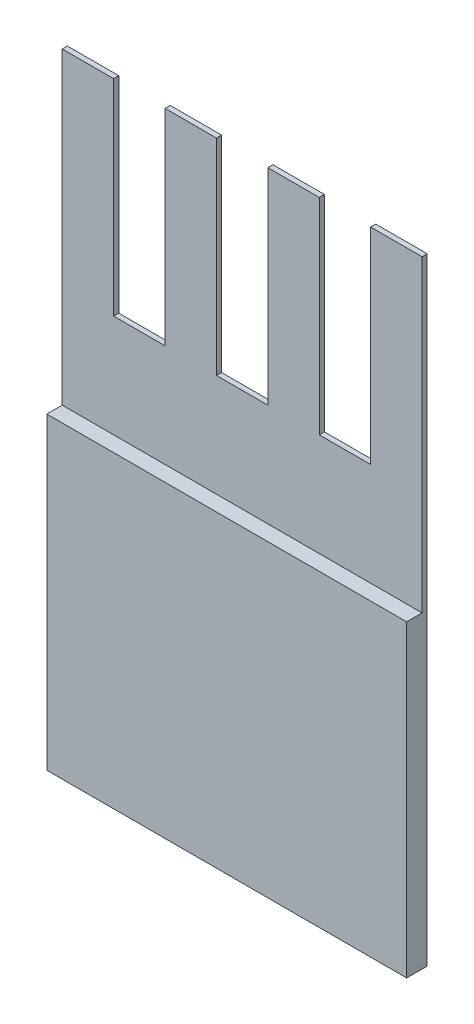
ISO-10303-21;
HEADER;
FILE_DESCRIPTION(('STEP AP214'),'2;1');
FILE_NAME('part.step','',(''),(''),'','','');
FILE_SCHEMA(('AUTOMOTIVE_DESIGN { 1 0 10303 214 1 1 1 1 }'));
ENDSEC;
DATA;
#1=APPLICATION_CONTEXT('core data for automotive mechanical design processes');
#2=APPLICATION_PROTOCOL_DEFINITION('international standard','automotive_design',2000,#1);
#3=PRODUCT_CONTEXT('',#1,'mechanical');
#4=PRODUCT('Part','Part','',(#3));
#5=PRODUCT_RELATED_PRODUCT_CATEGORY('part','',(#4));
#6=PRODUCT_DEFINITION_FORMATION('','',#4);
#7=PRODUCT_DEFINITION_CONTEXT('part definition',#1,'design');
#8=PRODUCT_DEFINITION('design','',#6,#7);
#9=PRODUCT_DEFINITION_SHAPE('','',#8);
#10=(LENGTH_UNIT() NAMED_UNIT(*) SI_UNIT(.MILLI.,.METRE.));
#11=(NAMED_UNIT(*) PLANE_ANGLE_UNIT() SI_UNIT($,.RADIAN.));
#12=(NAMED_UNIT(*) SI_UNIT($,.STERADIAN.) SOLID_ANGLE_UNIT());
#13=UNCERTAINTY_MEASURE_WITH_UNIT(LENGTH_MEASURE(1.E-05),#10,'distance_accuracy_value','');
#14=(GEOMETRIC_REPRESENTATION_CONTEXT(3) GLOBAL_UNCERTAINTY_ASSIGNED_CONTEXT((#13)) GLOBAL_UNIT_ASSIGNED_CONTEXT((#10,
#11,#12)) REPRESENTATION_CONTEXT('',''));
#15=CARTESIAN_POINT('',(0.,0.,0.));
#16=DIRECTION('',(0.,0.,1.));
#17=DIRECTION('',(1.,0.,0.));
#18=AXIS2_PLACEMENT_3D('',#15,#16,#17);
#19=CARTESIAN_POINT('',(0.,0.,2.));
#20=DIRECTION('',(0.,1.,0.));
#21=DIRECTION('',(0.,0.,1.));
#22=AXIS2_PLACEMENT_3D('',#19,#20,#21);
#23=PLANE('',#22);
#24=DIRECTION('',(1.,0.,0.));
#25=VECTOR('',#24,1.);
#26=CARTESIAN_POINT('',(0.,0.,0.5));
#27=LINE('',#26,#25);
#28=CARTESIAN_POINT('',(-17.5,0.,0.5));
#29=VERTEX_POINT('',#28);
#30=CARTESIAN_POINT('',(17.5,0.,0.5));
#31=VERTEX_POINT('',#30);
#32=EDGE_CURVE('E49',#29,#31,#27,.T.);
#33=ORIENTED_EDGE('',*,*,#32,.F.);
#34=DIRECTION('',(0.,0.,-1.));
#35=VECTOR('',#34,1.);
#36=CARTESIAN_POINT('',(-17.5,0.,2.));
#37=LINE('',#36,#35);
#38=CARTESIAN_POINT('',(-17.5,0.,2.));
#39=VERTEX_POINT('',#38);
#40=EDGE_CURVE('E11',#39,#29,#37,.T.);
#41=ORIENTED_EDGE('',*,*,#40,.F.);
#42=DIRECTION('',(1.,0.,0.));
#43=VECTOR('',#42,1.);
#44=CARTESIAN_POINT('',(0.,0.,2.));
#45=LINE('',#44,#43);
#46=CARTESIAN_POINT('',(17.5,0.,2.));
#47=VERTEX_POINT('',#46);
#48=EDGE_CURVE('E160',#39,#47,#45,.T.);
#49=ORIENTED_EDGE('',*,*,#48,.T.);
#50=DIRECTION('',(0.,0.,-1.));
#51=VECTOR('',#50,1.);
#52=CARTESIAN_POINT('',(17.5,0.,2.));
#53=LINE('',#52,#51);
#54=EDGE_CURVE('E56',#47,#31,#53,.T.);
#55=ORIENTED_EDGE('',*,*,#54,.T.);
#56=EDGE_LOOP('',(#33,#41,#49,#55));
#57=FACE_BOUND('',#56,.T.);
#58=ADVANCED_FACE('F35',(#57),#23,.T.);
#59=CARTESIAN_POINT('',(-17.5,0.,2.));
#60=DIRECTION('',(1.,0.,0.));
#61=DIRECTION('',(0.,0.,-1.));
#62=AXIS2_PLACEMENT_3D('',#59,#60,#61);
#63=PLANE('',#62);
#64=DIRECTION('',(0.,-1.,0.));
#65=VECTOR('',#64,1.);
#66=CARTESIAN_POINT('',(-17.5,0.,0.));
#67=LINE('',#66,#65);
#68=CARTESIAN_POINT('',(-17.5,30.,0.));
#69=VERTEX_POINT('',#68);
#70=CARTESIAN_POINT('',(-17.5,-30.,0.));
#71=VERTEX_POINT('',#70);
#72=EDGE_CURVE('E280',#69,#71,#67,.T.);
#73=ORIENTED_EDGE('',*,*,#72,.T.);
#74=DIRECTION('',(0.,0.,-1.));
#75=VECTOR('',#74,1.);
#76=CARTESIAN_POINT('',(-17.5,-30.,2.));
#77=LINE('',#76,#75);
#78=CARTESIAN_POINT('',(-17.5,-30.,2.));
#79=VERTEX_POINT('',#78);
#80=EDGE_CURVE('E42',#79,#71,#77,.T.);
#81=ORIENTED_EDGE('',*,*,#80,.F.);
#82=DIRECTION('',(0.,-1.,0.));
#83=VECTOR('',#82,1.);
#84=CARTESIAN_POINT('',(-17.5,0.,2.));
#85=LINE('',#84,#83);
#86=EDGE_CURVE('E282',#39,#79,#85,.T.);
#87=ORIENTED_EDGE('',*,*,#86,.F.);
#88=ORIENTED_EDGE('',*,*,#40,.T.);
#89=DIRECTION('',(0.,-1.,0.));
#90=VECTOR('',#89,1.);
#91=CARTESIAN_POINT('',(-17.5,0.,0.5));
#92=LINE('',#91,#90);
#93=CARTESIAN_POINT('',(-17.5,30.,0.5));
#94=VERTEX_POINT('',#93);
#95=EDGE_CURVE('E170',#94,#29,#92,.T.);
#96=ORIENTED_EDGE('',*,*,#95,.F.);
#97=DIRECTION('',(0.,0.,-1.));
#98=VECTOR('',#97,1.);
#99=CARTESIAN_POINT('',(-17.5,30.,0.5));
#100=LINE('',#99,#98);
#101=EDGE_CURVE('E213',#94,#69,#100,.T.);
#102=ORIENTED_EDGE('',*,*,#101,.T.);
#103=EDGE_LOOP('',(#73,#81,#87,#88,#96,#102));
#104=FACE_BOUND('',#103,.T.);
#105=ADVANCED_FACE('F301',(#104),#63,.F.);
#106=CARTESIAN_POINT('',(0.,-30.,2.));
#107=DIRECTION('',(0.,-1.,0.));
#108=DIRECTION('',(0.,0.,-1.));
#109=AXIS2_PLACEMENT_3D('',#106,#107,#108);
#110=PLANE('',#109);
#111=DIRECTION('',(-1.,0.,0.));
#112=VECTOR('',#111,1.);
#113=CARTESIAN_POINT('',(0.,-30.,0.));
#114=LINE('',#113,#112);
#115=CARTESIAN_POINT('',(17.5,-30.,0.));
#116=VERTEX_POINT('',#115);
#117=EDGE_CURVE('E291',#116,#71,#114,.T.);
#118=ORIENTED_EDGE('',*,*,#117,.F.);
#119=DIRECTION('',(0.,0.,-1.));
#120=VECTOR('',#119,1.);
#121=CARTESIAN_POINT('',(17.5,-30.,2.));
#122=LINE('',#121,#120);
#123=CARTESIAN_POINT('',(17.5,-30.,2.));
#124=VERTEX_POINT('',#123);
#125=EDGE_CURVE('E70',#124,#116,#122,.T.);
#126=ORIENTED_EDGE('',*,*,#125,.F.);
#127=DIRECTION('',(-1.,0.,0.));
#128=VECTOR('',#127,1.);
#129=CARTESIAN_POINT('',(0.,-30.,2.));
#130=LINE('',#129,#128);
#131=EDGE_CURVE('E285',#124,#79,#130,.T.);
#132=ORIENTED_EDGE('',*,*,#131,.T.);
#133=ORIENTED_EDGE('',*,*,#80,.T.);
#134=EDGE_LOOP('',(#118,#126,#132,#133));
#135=FACE_BOUND('',#134,.T.);
#136=ADVANCED_FACE('F298',(#135),#110,.T.);
#137=CARTESIAN_POINT('',(17.5,0.,2.));
#138=DIRECTION('',(1.,0.,0.));
#139=DIRECTION('',(0.,0.,-1.));
#140=AXIS2_PLACEMENT_3D('',#137,#138,#139);
#141=PLANE('',#140);
#142=DIRECTION('',(0.,-1.,0.));
#143=VECTOR('',#142,1.);
#144=CARTESIAN_POINT('',(17.5,0.,0.));
#145=LINE('',#144,#143);
#146=CARTESIAN_POINT('',(17.5,30.,0.));
#147=VERTEX_POINT('',#146);
#148=EDGE_CURVE('E283',#147,#116,#145,.T.);
#149=ORIENTED_EDGE('',*,*,#148,.F.);
#150=DIRECTION('',(0.,0.,-1.));
#151=VECTOR('',#150,1.);
#152=CARTESIAN_POINT('',(17.5,30.,0.5));
#153=LINE('',#152,#151);
#154=CARTESIAN_POINT('',(17.5,30.,0.5));
#155=VERTEX_POINT('',#154);
#156=EDGE_CURVE('E174',#155,#147,#153,.T.);
#157=ORIENTED_EDGE('',*,*,#156,.F.);
#158=DIRECTION('',(0.,-1.,0.));
#159=VECTOR('',#158,1.);
#160=CARTESIAN_POINT('',(17.5,0.,0.5));
#161=LINE('',#160,#159);
#162=EDGE_CURVE('E168',#155,#31,#161,.T.);
#163=ORIENTED_EDGE('',*,*,#162,.T.);
#164=ORIENTED_EDGE('',*,*,#54,.F.);
#165=DIRECTION('',(0.,-1.,0.));
#166=VECTOR('',#165,1.);
#167=CARTESIAN_POINT('',(17.5,0.,2.));
#168=LINE('',#167,#166);
#169=EDGE_CURVE('E162',#47,#124,#168,.T.);
#170=ORIENTED_EDGE('',*,*,#169,.T.);
#171=ORIENTED_EDGE('',*,*,#125,.T.);
#172=EDGE_LOOP('',(#149,#157,#163,#164,#170,#171));
#173=FACE_BOUND('',#172,.T.);
#174=ADVANCED_FACE('F172',(#173),#141,.T.);
#175=CARTESIAN_POINT('',(0.,0.,2.));
#176=DIRECTION('',(0.,0.,1.));
#177=DIRECTION('',(1.,0.,0.));
#178=AXIS2_PLACEMENT_3D('',#175,#176,#177);
#179=PLANE('',#178);
#180=ORIENTED_EDGE('',*,*,#48,.F.);
#181=ORIENTED_EDGE('',*,*,#86,.T.);
#182=ORIENTED_EDGE('',*,*,#131,.F.);
#183=ORIENTED_EDGE('',*,*,#169,.F.);
#184=EDGE_LOOP('',(#180,#181,#182,#183));
#185=FACE_BOUND('',#184,.T.);
#186=ADVANCED_FACE('F360',(#185),#179,.T.);
#187=CARTESIAN_POINT('',(0.,0.,0.));
#188=DIRECTION('',(0.,0.,1.));
#189=DIRECTION('',(1.,0.,0.));
#190=AXIS2_PLACEMENT_3D('',#187,#188,#189);
#191=PLANE('',#190);
#192=ORIENTED_EDGE('',*,*,#72,.F.);
#193=DIRECTION('',(-1.,0.,0.));
#194=VECTOR('',#193,1.);
#195=CARTESIAN_POINT('',(0.,30.,0.));
#196=LINE('',#195,#194);
#197=CARTESIAN_POINT('',(-12.5,30.,0.));
#198=VERTEX_POINT('',#197);
#199=EDGE_CURVE('E249',#198,#69,#196,.T.);
#200=ORIENTED_EDGE('',*,*,#199,.F.);
#201=DIRECTION('',(0.,-1.,0.));
#202=VECTOR('',#201,1.);
#203=CARTESIAN_POINT('',(-12.5,0.,0.));
#204=LINE('',#203,#202);
#205=CARTESIAN_POINT('',(-12.5,10.,0.));
#206=VERTEX_POINT('',#205);
#207=EDGE_CURVE('E246',#198,#206,#204,.T.);
#208=ORIENTED_EDGE('',*,*,#207,.T.);
#209=DIRECTION('',(1.,0.,0.));
#210=VECTOR('',#209,1.);
#211=CARTESIAN_POINT('',(0.,10.,0.));
#212=LINE('',#211,#210);
#213=CARTESIAN_POINT('',(-7.5,10.,0.));
#214=VERTEX_POINT('',#213);
#215=EDGE_CURVE('E243',#206,#214,#212,.T.);
#216=ORIENTED_EDGE('',*,*,#215,.T.);
#217=DIRECTION('',(0.,-1.,0.));
#218=VECTOR('',#217,1.);
#219=CARTESIAN_POINT('',(-7.5,0.,0.));
#220=LINE('',#219,#218);
#221=CARTESIAN_POINT('',(-7.5,30.,0.));
#222=VERTEX_POINT('',#221);
#223=EDGE_CURVE('E240',#222,#214,#220,.T.);
#224=ORIENTED_EDGE('',*,*,#223,.F.);
#225=DIRECTION('',(1.,0.,0.));
#226=VECTOR('',#225,1.);
#227=CARTESIAN_POINT('',(0.,30.,0.));
#228=LINE('',#227,#226);
#229=CARTESIAN_POINT('',(-2.5,30.,0.));
#230=VERTEX_POINT('',#229);
#231=EDGE_CURVE('E237',#222,#230,#228,.T.);
#232=ORIENTED_EDGE('',*,*,#231,.T.);
#233=DIRECTION('',(0.,-1.,0.));
#234=VECTOR('',#233,1.);
#235=CARTESIAN_POINT('',(-2.5,0.,0.));
#236=LINE('',#235,#234);
#237=CARTESIAN_POINT('',(-2.5,10.,0.));
#238=VERTEX_POINT('',#237);
#239=EDGE_CURVE('E234',#230,#238,#236,.T.);
#240=ORIENTED_EDGE('',*,*,#239,.T.);
#241=DIRECTION('',(1.,0.,0.));
#242=VECTOR('',#241,1.);
#243=CARTESIAN_POINT('',(0.,10.,0.));
#244=LINE('',#243,#242);
#245=CARTESIAN_POINT('',(2.5,10.,0.));
#246=VERTEX_POINT('',#245);
#247=EDGE_CURVE('E231',#238,#246,#244,.T.);
#248=ORIENTED_EDGE('',*,*,#247,.T.);
#249=DIRECTION('',(0.,-1.,0.));
#250=VECTOR('',#249,1.);
#251=CARTESIAN_POINT('',(2.5,0.,0.));
#252=LINE('',#251,#250);
#253=CARTESIAN_POINT('',(2.5,30.,0.));
#254=VERTEX_POINT('',#253);
#255=EDGE_CURVE('E228',#254,#246,#252,.T.);
#256=ORIENTED_EDGE('',*,*,#255,.F.);
#257=DIRECTION('',(1.,0.,0.));
#258=VECTOR('',#257,1.);
#259=CARTESIAN_POINT('',(0.,30.,0.));
#260=LINE('',#259,#258);
#261=CARTESIAN_POINT('',(7.49999999999999,30.,0.));
#262=VERTEX_POINT('',#261);
#263=EDGE_CURVE('E225',#254,#262,#260,.T.);
#264=ORIENTED_EDGE('',*,*,#263,.T.);
#265=DIRECTION('',(0.,-1.,0.));
#266=VECTOR('',#265,1.);
#267=CARTESIAN_POINT('',(7.49999999999999,0.,0.));
#268=LINE('',#267,#266);
#269=CARTESIAN_POINT('',(7.49999999999999,10.,0.));
#270=VERTEX_POINT('',#269);
#271=EDGE_CURVE('E222',#262,#270,#268,.T.);
#272=ORIENTED_EDGE('',*,*,#271,.T.);
#273=DIRECTION('',(1.,0.,0.));
#274=VECTOR('',#273,1.);
#275=CARTESIAN_POINT('',(0.,10.,0.));
#276=LINE('',#275,#274);
#277=CARTESIAN_POINT('',(12.5,10.,0.));
#278=VERTEX_POINT('',#277);
#279=EDGE_CURVE('E219',#270,#278,#276,.T.);
#280=ORIENTED_EDGE('',*,*,#279,.T.);
#281=DIRECTION('',(0.,-1.,0.));
#282=VECTOR('',#281,1.);
#283=CARTESIAN_POINT('',(12.5,0.,0.));
#284=LINE('',#283,#282);
#285=CARTESIAN_POINT('',(12.5,30.,0.));
#286=VERTEX_POINT('',#285);
#287=EDGE_CURVE('E216',#286,#278,#284,.T.);
#288=ORIENTED_EDGE('',*,*,#287,.F.);
#289=DIRECTION('',(-1.,0.,0.));
#290=VECTOR('',#289,1.);
#291=CARTESIAN_POINT('',(0.,30.,0.));
#292=LINE('',#291,#290);
#293=EDGE_CURVE('E214',#147,#286,#292,.T.);
#294=ORIENTED_EDGE('',*,*,#293,.F.);
#295=ORIENTED_EDGE('',*,*,#148,.T.);
#296=ORIENTED_EDGE('',*,*,#117,.T.);
#297=EDGE_LOOP('',(#192,#200,#208,#216,#224,#232,#240,#248,#256,#264,#272,#280,#288,#294,#295,#296));
#298=FACE_BOUND('',#297,.T.);
#299=ADVANCED_FACE('F305',(#298),#191,.F.);
#300=CARTESIAN_POINT('',(0.,30.,0.5));
#301=DIRECTION('',(0.,-1.,0.));
#302=DIRECTION('',(0.,0.,-1.));
#303=AXIS2_PLACEMENT_3D('',#300,#301,#302);
#304=PLANE('',#303);
#305=ORIENTED_EDGE('',*,*,#293,.T.);
#306=DIRECTION('',(0.,0.,-1.));
#307=VECTOR('',#306,1.);
#308=CARTESIAN_POINT('',(12.5,30.,0.5));
#309=LINE('',#308,#307);
#310=CARTESIAN_POINT('',(12.5,30.,0.5));
#311=VERTEX_POINT('',#310);
#312=EDGE_CURVE('E276',#311,#286,#309,.T.);
#313=ORIENTED_EDGE('',*,*,#312,.F.);
#314=DIRECTION('',(-1.,0.,0.));
#315=VECTOR('',#314,1.);
#316=CARTESIAN_POINT('',(0.,30.,0.5));
#317=LINE('',#316,#315);
#318=EDGE_CURVE('E176',#155,#311,#317,.T.);
#319=ORIENTED_EDGE('',*,*,#318,.F.);
#320=ORIENTED_EDGE('',*,*,#156,.T.);
#321=EDGE_LOOP('',(#305,#313,#319,#320));
#322=FACE_BOUND('',#321,.T.);
#323=ADVANCED_FACE('F309',(#322),#304,.F.);
#324=CARTESIAN_POINT('',(12.5,0.,0.5));
#325=DIRECTION('',(1.,0.,0.));
#326=DIRECTION('',(0.,1.,0.));
#327=AXIS2_PLACEMENT_3D('',#324,#325,#326);
#328=PLANE('',#327);
#329=ORIENTED_EDGE('',*,*,#287,.T.);
#330=DIRECTION('',(0.,0.,-1.));
#331=VECTOR('',#330,1.);
#332=CARTESIAN_POINT('',(12.5,10.,0.5));
#333=LINE('',#332,#331);
#334=CARTESIAN_POINT('',(12.5,10.,0.5));
#335=VERTEX_POINT('',#334);
#336=EDGE_CURVE('E274',#335,#278,#333,.T.);
#337=ORIENTED_EDGE('',*,*,#336,.F.);
#338=DIRECTION('',(0.,-1.,0.));
#339=VECTOR('',#338,1.);
#340=CARTESIAN_POINT('',(12.5,0.,0.5));
#341=LINE('',#340,#339);
#342=EDGE_CURVE('E178',#311,#335,#341,.T.);
#343=ORIENTED_EDGE('',*,*,#342,.F.);
#344=ORIENTED_EDGE('',*,*,#312,.T.);
#345=EDGE_LOOP('',(#329,#337,#343,#344));
#346=FACE_BOUND('',#345,.T.);
#347=ADVANCED_FACE('F316',(#346),#328,.F.);
#348=CARTESIAN_POINT('',(0.,10.,0.5));
#349=DIRECTION('',(0.,1.,0.));
#350=DIRECTION('',(0.,0.,1.));
#351=AXIS2_PLACEMENT_3D('',#348,#349,#350);
#352=PLANE('',#351);
#353=ORIENTED_EDGE('',*,*,#279,.F.);
#354=DIRECTION('',(0.,0.,-1.));
#355=VECTOR('',#354,1.);
#356=CARTESIAN_POINT('',(7.49999999999999,10.,0.5));
#357=LINE('',#356,#355);
#358=CARTESIAN_POINT('',(7.49999999999999,10.,0.5));
#359=VERTEX_POINT('',#358);
#360=EDGE_CURVE('E272',#359,#270,#357,.T.);
#361=ORIENTED_EDGE('',*,*,#360,.F.);
#362=DIRECTION('',(1.,0.,0.));
#363=VECTOR('',#362,1.);
#364=CARTESIAN_POINT('',(0.,10.,0.5));
#365=LINE('',#364,#363);
#366=EDGE_CURVE('E183',#359,#335,#365,.T.);
#367=ORIENTED_EDGE('',*,*,#366,.T.);
#368=ORIENTED_EDGE('',*,*,#336,.T.);
#369=EDGE_LOOP('',(#353,#361,#367,#368));
#370=FACE_BOUND('',#369,.T.);
#371=ADVANCED_FACE('F319',(#370),#352,.T.);
#372=CARTESIAN_POINT('',(7.49999999999999,0.,0.5));
#373=DIRECTION('',(1.,0.,0.));
#374=DIRECTION('',(0.,0.,-1.));
#375=AXIS2_PLACEMENT_3D('',#372,#373,#374);
#376=PLANE('',#375);
#377=ORIENTED_EDGE('',*,*,#271,.F.);
#378=DIRECTION('',(0.,0.,-1.));
#379=VECTOR('',#378,1.);
#380=CARTESIAN_POINT('',(7.49999999999999,30.,0.5));
#381=LINE('',#380,#379);
#382=CARTESIAN_POINT('',(7.49999999999999,30.,0.5));
#383=VERTEX_POINT('',#382);
#384=EDGE_CURVE('E270',#383,#262,#381,.T.);
#385=ORIENTED_EDGE('',*,*,#384,.F.);
#386=DIRECTION('',(0.,-1.,0.));
#387=VECTOR('',#386,1.);
#388=CARTESIAN_POINT('',(7.49999999999999,0.,0.5));
#389=LINE('',#388,#387);
#390=EDGE_CURVE('E186',#383,#359,#389,.T.);
#391=ORIENTED_EDGE('',*,*,#390,.T.);
#392=ORIENTED_EDGE('',*,*,#360,.T.);
#393=EDGE_LOOP('',(#377,#385,#391,#392));
#394=FACE_BOUND('',#393,.T.);
#395=ADVANCED_FACE('F322',(#394),#376,.T.);
#396=CARTESIAN_POINT('',(0.,30.,0.5));
#397=DIRECTION('',(0.,1.,0.));
#398=DIRECTION('',(0.,0.,1.));
#399=AXIS2_PLACEMENT_3D('',#396,#397,#398);
#400=PLANE('',#399);
#401=ORIENTED_EDGE('',*,*,#263,.F.);
#402=DIRECTION('',(0.,0.,-1.));
#403=VECTOR('',#402,1.);
#404=CARTESIAN_POINT('',(2.5,30.,0.5));
#405=LINE('',#404,#403);
#406=CARTESIAN_POINT('',(2.5,30.,0.5));
#407=VERTEX_POINT('',#406);
#408=EDGE_CURVE('E268',#407,#254,#405,.T.);
#409=ORIENTED_EDGE('',*,*,#408,.F.);
#410=DIRECTION('',(1.,0.,0.));
#411=VECTOR('',#410,1.);
#412=CARTESIAN_POINT('',(0.,30.,0.5));
#413=LINE('',#412,#411);
#414=EDGE_CURVE('E189',#407,#383,#413,.T.);
#415=ORIENTED_EDGE('',*,*,#414,.T.);
#416=ORIENTED_EDGE('',*,*,#384,.T.);
#417=EDGE_LOOP('',(#401,#409,#415,#416));
#418=FACE_BOUND('',#417,.T.);
#419=ADVANCED_FACE('F326',(#418),#400,.T.);
#420=CARTESIAN_POINT('',(2.5,0.,0.5));
#421=DIRECTION('',(1.,0.,0.));
#422=DIRECTION('',(0.,1.,0.));
#423=AXIS2_PLACEMENT_3D('',#420,#421,#422);
#424=PLANE('',#423);
#425=ORIENTED_EDGE('',*,*,#255,.T.);
#426=DIRECTION('',(0.,0.,-1.));
#427=VECTOR('',#426,1.);
#428=CARTESIAN_POINT('',(2.5,10.,0.5));
#429=LINE('',#428,#427);
#430=CARTESIAN_POINT('',(2.5,10.,0.5));
#431=VERTEX_POINT('',#430);
#432=EDGE_CURVE('E266',#431,#246,#429,.T.);
#433=ORIENTED_EDGE('',*,*,#432,.F.);
#434=DIRECTION('',(0.,-1.,0.));
#435=VECTOR('',#434,1.);
#436=CARTESIAN_POINT('',(2.5,0.,0.5));
#437=LINE('',#436,#435);
#438=EDGE_CURVE('E192',#407,#431,#437,.T.);
#439=ORIENTED_EDGE('',*,*,#438,.F.);
#440=ORIENTED_EDGE('',*,*,#408,.T.);
#441=EDGE_LOOP('',(#425,#433,#439,#440));
#442=FACE_BOUND('',#441,.T.);
#443=ADVANCED_FACE('F331',(#442),#424,.F.);
#444=CARTESIAN_POINT('',(0.,10.,0.5));
#445=DIRECTION('',(0.,1.,0.));
#446=DIRECTION('',(0.,0.,1.));
#447=AXIS2_PLACEMENT_3D('',#444,#445,#446);
#448=PLANE('',#447);
#449=ORIENTED_EDGE('',*,*,#247,.F.);
#450=DIRECTION('',(0.,0.,-1.));
#451=VECTOR('',#450,1.);
#452=CARTESIAN_POINT('',(-2.5,10.,0.5));
#453=LINE('',#452,#451);
#454=CARTESIAN_POINT('',(-2.5,10.,0.5));
#455=VERTEX_POINT('',#454);
#456=EDGE_CURVE('E264',#455,#238,#453,.T.);
#457=ORIENTED_EDGE('',*,*,#456,.F.);
#458=DIRECTION('',(1.,0.,0.));
#459=VECTOR('',#458,1.);
#460=CARTESIAN_POINT('',(0.,10.,0.5));
#461=LINE('',#460,#459);
#462=EDGE_CURVE('E194',#455,#431,#461,.T.);
#463=ORIENTED_EDGE('',*,*,#462,.T.);
#464=ORIENTED_EDGE('',*,*,#432,.T.);
#465=EDGE_LOOP('',(#449,#457,#463,#464));
#466=FACE_BOUND('',#465,.T.);
#467=ADVANCED_FACE('F446',(#466),#448,.T.);
#468=CARTESIAN_POINT('',(-2.5,0.,0.5));
#469=DIRECTION('',(1.,0.,0.));
#470=DIRECTION('',(0.,1.,0.));
#471=AXIS2_PLACEMENT_3D('',#468,#469,#470);
#472=PLANE('',#471);
#473=ORIENTED_EDGE('',*,*,#239,.F.);
#474=DIRECTION('',(0.,0.,-1.));
#475=VECTOR('',#474,1.);
#476=CARTESIAN_POINT('',(-2.5,30.,0.5));
#477=LINE('',#476,#475);
#478=CARTESIAN_POINT('',(-2.5,30.,0.5));
#479=VERTEX_POINT('',#478);
#480=EDGE_CURVE('E262',#479,#230,#477,.T.);
#481=ORIENTED_EDGE('',*,*,#480,.F.);
#482=DIRECTION('',(0.,-1.,0.));
#483=VECTOR('',#482,1.);
#484=CARTESIAN_POINT('',(-2.5,0.,0.5));
#485=LINE('',#484,#483);
#486=EDGE_CURVE('E197',#479,#455,#485,.T.);
#487=ORIENTED_EDGE('',*,*,#486,.T.);
#488=ORIENTED_EDGE('',*,*,#456,.T.);
#489=EDGE_LOOP('',(#473,#481,#487,#488));
#490=FACE_BOUND('',#489,.T.);
#491=ADVANCED_FACE('F338',(#490),#472,.T.);
#492=CARTESIAN_POINT('',(0.,30.,0.5));
#493=DIRECTION('',(0.,1.,0.));
#494=DIRECTION('',(0.,0.,1.));
#495=AXIS2_PLACEMENT_3D('',#492,#493,#494);
#496=PLANE('',#495);
#497=ORIENTED_EDGE('',*,*,#231,.F.);
#498=DIRECTION('',(0.,0.,-1.));
#499=VECTOR('',#498,1.);
#500=CARTESIAN_POINT('',(-7.5,30.,0.5));
#501=LINE('',#500,#499);
#502=CARTESIAN_POINT('',(-7.5,30.,0.5));
#503=VERTEX_POINT('',#502);
#504=EDGE_CURVE('E260',#503,#222,#501,.T.);
#505=ORIENTED_EDGE('',*,*,#504,.F.);
#506=DIRECTION('',(1.,0.,0.));
#507=VECTOR('',#506,1.);
#508=CARTESIAN_POINT('',(0.,30.,0.5));
#509=LINE('',#508,#507);
#510=EDGE_CURVE('E200',#503,#479,#509,.T.);
#511=ORIENTED_EDGE('',*,*,#510,.T.);
#512=ORIENTED_EDGE('',*,*,#480,.T.);
#513=EDGE_LOOP('',(#497,#505,#511,#512));
#514=FACE_BOUND('',#513,.T.);
#515=ADVANCED_FACE('F342',(#514),#496,.T.);
#516=CARTESIAN_POINT('',(-7.5,0.,0.5));
#517=DIRECTION('',(1.,0.,0.));
#518=DIRECTION('',(0.,1.,0.));
#519=AXIS2_PLACEMENT_3D('',#516,#517,#518);
#520=PLANE('',#519);
#521=ORIENTED_EDGE('',*,*,#223,.T.);
#522=DIRECTION('',(0.,0.,-1.));
#523=VECTOR('',#522,1.);
#524=CARTESIAN_POINT('',(-7.5,10.,0.5));
#525=LINE('',#524,#523);
#526=CARTESIAN_POINT('',(-7.5,10.,0.5));
#527=VERTEX_POINT('',#526);
#528=EDGE_CURVE('E258',#527,#214,#525,.T.);
#529=ORIENTED_EDGE('',*,*,#528,.F.);
#530=DIRECTION('',(0.,-1.,0.));
#531=VECTOR('',#530,1.);
#532=CARTESIAN_POINT('',(-7.5,0.,0.5));
#533=LINE('',#532,#531);
#534=EDGE_CURVE('E203',#503,#527,#533,.T.);
#535=ORIENTED_EDGE('',*,*,#534,.F.);
#536=ORIENTED_EDGE('',*,*,#504,.T.);
#537=EDGE_LOOP('',(#521,#529,#535,#536));
#538=FACE_BOUND('',#537,.T.);
#539=ADVANCED_FACE('F348',(#538),#520,.F.);
#540=CARTESIAN_POINT('',(0.,10.,0.5));
#541=DIRECTION('',(0.,1.,0.));
#542=DIRECTION('',(0.,0.,1.));
#543=AXIS2_PLACEMENT_3D('',#540,#541,#542);
#544=PLANE('',#543);
#545=ORIENTED_EDGE('',*,*,#215,.F.);
#546=DIRECTION('',(0.,0.,-1.));
#547=VECTOR('',#546,1.);
#548=CARTESIAN_POINT('',(-12.5,10.,0.5));
#549=LINE('',#548,#547);
#550=CARTESIAN_POINT('',(-12.5,10.,0.5));
#551=VERTEX_POINT('',#550);
#552=EDGE_CURVE('E256',#551,#206,#549,.T.);
#553=ORIENTED_EDGE('',*,*,#552,.F.);
#554=DIRECTION('',(1.,0.,0.));
#555=VECTOR('',#554,1.);
#556=CARTESIAN_POINT('',(0.,10.,0.5));
#557=LINE('',#556,#555);
#558=EDGE_CURVE('E205',#551,#527,#557,.T.);
#559=ORIENTED_EDGE('',*,*,#558,.T.);
#560=ORIENTED_EDGE('',*,*,#528,.T.);
#561=EDGE_LOOP('',(#545,#553,#559,#560));
#562=FACE_BOUND('',#561,.T.);
#563=ADVANCED_FACE('F352',(#562),#544,.T.);
#564=CARTESIAN_POINT('',(-12.5,0.,0.5));
#565=DIRECTION('',(1.,0.,0.));
#566=DIRECTION('',(0.,1.,0.));
#567=AXIS2_PLACEMENT_3D('',#564,#565,#566);
#568=PLANE('',#567);
#569=ORIENTED_EDGE('',*,*,#207,.F.);
#570=DIRECTION('',(0.,0.,-1.));
#571=VECTOR('',#570,1.);
#572=CARTESIAN_POINT('',(-12.5,30.,0.5));
#573=LINE('',#572,#571);
#574=CARTESIAN_POINT('',(-12.5,30.,0.5));
#575=VERTEX_POINT('',#574);
#576=EDGE_CURVE('E254',#575,#198,#573,.T.);
#577=ORIENTED_EDGE('',*,*,#576,.F.);
#578=DIRECTION('',(0.,-1.,0.));
#579=VECTOR('',#578,1.);
#580=CARTESIAN_POINT('',(-12.5,0.,0.5));
#581=LINE('',#580,#579);
#582=EDGE_CURVE('E208',#575,#551,#581,.T.);
#583=ORIENTED_EDGE('',*,*,#582,.T.);
#584=ORIENTED_EDGE('',*,*,#552,.T.);
#585=EDGE_LOOP('',(#569,#577,#583,#584));
#586=FACE_BOUND('',#585,.T.);
#587=ADVANCED_FACE('F355',(#586),#568,.T.);
#588=CARTESIAN_POINT('',(0.,30.,0.5));
#589=DIRECTION('',(0.,-1.,0.));
#590=DIRECTION('',(0.,0.,-1.));
#591=AXIS2_PLACEMENT_3D('',#588,#589,#590);
#592=PLANE('',#591);
#593=ORIENTED_EDGE('',*,*,#199,.T.);
#594=ORIENTED_EDGE('',*,*,#101,.F.);
#595=DIRECTION('',(-1.,0.,0.));
#596=VECTOR('',#595,1.);
#597=CARTESIAN_POINT('',(0.,30.,0.5));
#598=LINE('',#597,#596);
#599=EDGE_CURVE('E211',#575,#94,#598,.T.);
#600=ORIENTED_EDGE('',*,*,#599,.F.);
#601=ORIENTED_EDGE('',*,*,#576,.T.);
#602=EDGE_LOOP('',(#593,#594,#600,#601));
#603=FACE_BOUND('',#602,.T.);
#604=ADVANCED_FACE('F358',(#603),#592,.F.);
#605=CARTESIAN_POINT('',(0.,0.,0.5));
#606=DIRECTION('',(0.,0.,1.));
#607=DIRECTION('',(1.,0.,0.));
#608=AXIS2_PLACEMENT_3D('',#605,#606,#607);
#609=PLANE('',#608);
#610=ORIENTED_EDGE('',*,*,#95,.T.);
#611=ORIENTED_EDGE('',*,*,#32,.T.);
#612=ORIENTED_EDGE('',*,*,#162,.F.);
#613=ORIENTED_EDGE('',*,*,#318,.T.);
#614=ORIENTED_EDGE('',*,*,#342,.T.);
#615=ORIENTED_EDGE('',*,*,#366,.F.);
#616=ORIENTED_EDGE('',*,*,#390,.F.);
#617=ORIENTED_EDGE('',*,*,#414,.F.);
#618=ORIENTED_EDGE('',*,*,#438,.T.);
#619=ORIENTED_EDGE('',*,*,#462,.F.);
#620=ORIENTED_EDGE('',*,*,#486,.F.);
#621=ORIENTED_EDGE('',*,*,#510,.F.);
#622=ORIENTED_EDGE('',*,*,#534,.T.);
#623=ORIENTED_EDGE('',*,*,#558,.F.);
#624=ORIENTED_EDGE('',*,*,#582,.F.);
#625=ORIENTED_EDGE('',*,*,#599,.T.);
#626=EDGE_LOOP('',(#610,#611,#612,#613,#614,#615,#616,#617,#618,#619,#620,#621,#622,#623,#624,#625));
#627=FACE_BOUND('',#626,.T.);
#628=ADVANCED_FACE('F167',(#627),#609,.T.);
#629=CLOSED_SHELL('',(#58,#105,#136,#174,#186,#299,#323,#347,#371,#395,#419,#443,#467,#491,#515,
#539,#563,#587,#604,#628));
#630=MANIFOLD_SOLID_BREP('B2',#629);
#631=ADVANCED_BREP_SHAPE_REPRESENTATION('',(#18,#630),#14);
#632=SHAPE_DEFINITION_REPRESENTATION(#9,#631);
ENDSEC;
END-ISO-10303-21;
